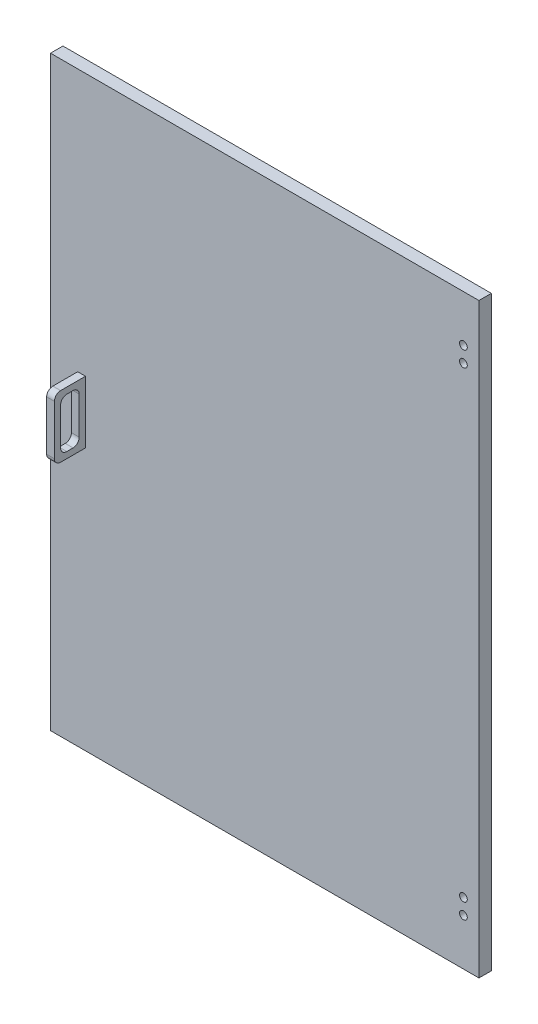
ISO-10303-21;
HEADER;
FILE_DESCRIPTION(('STEP AP214'),'2;1');
FILE_NAME('part.step','',(''),(''),'','','');
FILE_SCHEMA(('AUTOMOTIVE_DESIGN { 1 0 10303 214 1 1 1 1 }'));
ENDSEC;
DATA;
#1=APPLICATION_CONTEXT('core data for automotive mechanical design processes');
#2=APPLICATION_PROTOCOL_DEFINITION('international standard','automotive_design',2000,#1);
#3=PRODUCT_CONTEXT('',#1,'mechanical');
#4=PRODUCT('Part','Part','',(#3));
#5=PRODUCT_RELATED_PRODUCT_CATEGORY('part','',(#4));
#6=PRODUCT_DEFINITION_FORMATION('','',#4);
#7=PRODUCT_DEFINITION_CONTEXT('part definition',#1,'design');
#8=PRODUCT_DEFINITION('design','',#6,#7);
#9=PRODUCT_DEFINITION_SHAPE('','',#8);
#10=(LENGTH_UNIT() NAMED_UNIT(*) SI_UNIT(.MILLI.,.METRE.));
#11=(NAMED_UNIT(*) PLANE_ANGLE_UNIT() SI_UNIT($,.RADIAN.));
#12=(NAMED_UNIT(*) SI_UNIT($,.STERADIAN.) SOLID_ANGLE_UNIT());
#13=UNCERTAINTY_MEASURE_WITH_UNIT(LENGTH_MEASURE(1.E-05),#10,'distance_accuracy_value','');
#14=(GEOMETRIC_REPRESENTATION_CONTEXT(3) GLOBAL_UNCERTAINTY_ASSIGNED_CONTEXT((#13)) GLOBAL_UNIT_ASSIGNED_CONTEXT((#10,
#11,#12)) REPRESENTATION_CONTEXT('',''));
#15=CARTESIAN_POINT('',(0.,0.,0.));
#16=DIRECTION('',(0.,0.,1.));
#17=DIRECTION('',(1.,0.,0.));
#18=AXIS2_PLACEMENT_3D('',#15,#16,#17);
#19=CARTESIAN_POINT('',(0.,0.,0.));
#20=DIRECTION('',(0.,0.,1.));
#21=DIRECTION('',(1.,0.,0.));
#22=AXIS2_PLACEMENT_3D('',#19,#20,#21);
#23=PLANE('',#22);
#24=CARTESIAN_POINT('',(81.28,100.965,0.));
#25=DIRECTION('',(0.,0.,1.));
#26=DIRECTION('',(1.,0.,0.));
#27=AXIS2_PLACEMENT_3D('',#24,#25,#26);
#28=CIRCLE('',#27,1.58749999999999);
#29=CARTESIAN_POINT('',(82.8675,100.965,0.));
#30=VERTEX_POINT('',#29);
#31=EDGE_CURVE('E227',#30,#30,#28,.T.);
#32=ORIENTED_EDGE('',*,*,#31,.F.);
#33=EDGE_LOOP('',(#32));
#34=FACE_BOUND('',#33,.T.);
#35=CARTESIAN_POINT('',(81.28,94.615,0.));
#36=DIRECTION('',(0.,0.,1.));
#37=DIRECTION('',(1.,0.,0.));
#38=AXIS2_PLACEMENT_3D('',#35,#36,#37);
#39=CIRCLE('',#38,1.58749999999999);
#40=CARTESIAN_POINT('',(82.8675,94.615,0.));
#41=VERTEX_POINT('',#40);
#42=EDGE_CURVE('E231',#41,#41,#39,.T.);
#43=ORIENTED_EDGE('',*,*,#42,.F.);
#44=EDGE_LOOP('',(#43));
#45=FACE_BOUND('',#44,.T.);
#46=CARTESIAN_POINT('',(81.28,-94.615,0.));
#47=DIRECTION('',(0.,0.,1.));
#48=DIRECTION('',(-1.,0.,0.));
#49=AXIS2_PLACEMENT_3D('',#46,#47,#48);
#50=CIRCLE('',#49,1.58749999999999);
#51=CARTESIAN_POINT('',(79.6925,-94.615,0.));
#52=VERTEX_POINT('',#51);
#53=EDGE_CURVE('E239',#52,#52,#50,.T.);
#54=ORIENTED_EDGE('',*,*,#53,.F.);
#55=EDGE_LOOP('',(#54));
#56=FACE_BOUND('',#55,.T.);
#57=CARTESIAN_POINT('',(81.28,-100.965,0.));
#58=DIRECTION('',(0.,0.,1.));
#59=DIRECTION('',(-1.,0.,0.));
#60=AXIS2_PLACEMENT_3D('',#57,#58,#59);
#61=CIRCLE('',#60,1.58749999999999);
#62=CARTESIAN_POINT('',(79.6925,-100.965,0.));
#63=VERTEX_POINT('',#62);
#64=EDGE_CURVE('E247',#63,#63,#61,.T.);
#65=ORIENTED_EDGE('',*,*,#64,.F.);
#66=EDGE_LOOP('',(#65));
#67=FACE_BOUND('',#66,.T.);
#68=DIRECTION('',(0.,-1.,0.));
#69=VECTOR('',#68,1.);
#70=CARTESIAN_POINT('',(-87.63,120.015,0.));
#71=LINE('',#70,#69);
#72=CARTESIAN_POINT('',(-87.63,120.015,0.));
#73=VERTEX_POINT('',#72);
#74=CARTESIAN_POINT('',(-87.63,-120.015,0.));
#75=VERTEX_POINT('',#74);
#76=EDGE_CURVE('E226',#73,#75,#71,.T.);
#77=ORIENTED_EDGE('',*,*,#76,.T.);
#78=DIRECTION('',(1.,0.,0.));
#79=VECTOR('',#78,1.);
#80=CARTESIAN_POINT('',(-87.63,-120.015,0.));
#81=LINE('',#80,#79);
#82=CARTESIAN_POINT('',(87.63,-120.015,0.));
#83=VERTEX_POINT('',#82);
#84=EDGE_CURVE('E275',#75,#83,#81,.T.);
#85=ORIENTED_EDGE('',*,*,#84,.T.);
#86=DIRECTION('',(0.,1.,0.));
#87=VECTOR('',#86,1.);
#88=CARTESIAN_POINT('',(87.63,120.015,0.));
#89=LINE('',#88,#87);
#90=CARTESIAN_POINT('',(87.63,120.015,0.));
#91=VERTEX_POINT('',#90);
#92=EDGE_CURVE('E279',#83,#91,#89,.T.);
#93=ORIENTED_EDGE('',*,*,#92,.T.);
#94=DIRECTION('',(-1.,0.,0.));
#95=VECTOR('',#94,1.);
#96=CARTESIAN_POINT('',(-87.63,120.015,0.));
#97=LINE('',#96,#95);
#98=EDGE_CURVE('E259',#91,#73,#97,.T.);
#99=ORIENTED_EDGE('',*,*,#98,.T.);
#100=EDGE_LOOP('',(#77,#85,#93,#99));
#101=FACE_BOUND('',#100,.T.);
#102=DIRECTION('',(-1.,0.,0.));
#103=VECTOR('',#102,1.);
#104=CARTESIAN_POINT('',(-76.5175,12.7,0.));
#105=LINE('',#104,#103);
#106=CARTESIAN_POINT('',(-73.3425,12.7,0.));
#107=VERTEX_POINT('',#106);
#108=CARTESIAN_POINT('',(-76.5175,12.7,0.));
#109=VERTEX_POINT('',#108);
#110=EDGE_CURVE('E181',#107,#109,#105,.T.);
#111=ORIENTED_EDGE('',*,*,#110,.F.);
#112=DIRECTION('',(0.,1.,0.));
#113=VECTOR('',#112,1.);
#114=CARTESIAN_POINT('',(-73.3425,-12.7,0.));
#115=LINE('',#114,#113);
#116=CARTESIAN_POINT('',(-73.3425,-12.7,0.));
#117=VERTEX_POINT('',#116);
#118=EDGE_CURVE('E192',#117,#107,#115,.T.);
#119=ORIENTED_EDGE('',*,*,#118,.F.);
#120=DIRECTION('',(1.,0.,0.));
#121=VECTOR('',#120,1.);
#122=CARTESIAN_POINT('',(-76.5175,-12.7,0.));
#123=LINE('',#122,#121);
#124=CARTESIAN_POINT('',(-76.5175,-12.7,0.));
#125=VERTEX_POINT('',#124);
#126=EDGE_CURVE('E207',#125,#117,#123,.T.);
#127=ORIENTED_EDGE('',*,*,#126,.F.);
#128=DIRECTION('',(0.,-1.,0.));
#129=VECTOR('',#128,1.);
#130=CARTESIAN_POINT('',(-76.5175,-12.7,0.));
#131=LINE('',#130,#129);
#132=EDGE_CURVE('E203',#109,#125,#131,.T.);
#133=ORIENTED_EDGE('',*,*,#132,.F.);
#134=EDGE_LOOP('',(#111,#119,#127,#133));
#135=FACE_BOUND('',#134,.T.);
#136=ADVANCED_FACE('F51',(#34,#45,#56,#67,#101,#135),#23,.T.);
#137=CARTESIAN_POINT('',(-87.63,120.015,-5.08));
#138=DIRECTION('',(-1.,0.,0.));
#139=DIRECTION('',(0.,-1.,0.));
#140=AXIS2_PLACEMENT_3D('',#137,#138,#139);
#141=PLANE('',#140);
#142=ORIENTED_EDGE('',*,*,#76,.F.);
#143=DIRECTION('',(0.,0.,1.));
#144=VECTOR('',#143,1.);
#145=CARTESIAN_POINT('',(-87.63,120.015,-5.08));
#146=LINE('',#145,#144);
#147=CARTESIAN_POINT('',(-87.63,120.015,-5.08));
#148=VERTEX_POINT('',#147);
#149=EDGE_CURVE('E286',#148,#73,#146,.T.);
#150=ORIENTED_EDGE('',*,*,#149,.F.);
#151=DIRECTION('',(0.,-1.,0.));
#152=VECTOR('',#151,1.);
#153=CARTESIAN_POINT('',(-87.63,120.015,-5.08));
#154=LINE('',#153,#152);
#155=CARTESIAN_POINT('',(-87.63,-120.015,-5.08));
#156=VERTEX_POINT('',#155);
#157=EDGE_CURVE('E254',#148,#156,#154,.T.);
#158=ORIENTED_EDGE('',*,*,#157,.T.);
#159=DIRECTION('',(0.,0.,1.));
#160=VECTOR('',#159,1.);
#161=CARTESIAN_POINT('',(-87.63,-120.015,-5.08));
#162=LINE('',#161,#160);
#163=EDGE_CURVE('E271',#156,#75,#162,.T.);
#164=ORIENTED_EDGE('',*,*,#163,.T.);
#165=EDGE_LOOP('',(#142,#150,#158,#164));
#166=FACE_BOUND('',#165,.T.);
#167=ADVANCED_FACE('F454',(#166),#141,.T.);
#168=CARTESIAN_POINT('',(-87.63,120.015,-5.08));
#169=DIRECTION('',(0.,1.,0.));
#170=DIRECTION('',(0.,0.,1.));
#171=AXIS2_PLACEMENT_3D('',#168,#169,#170);
#172=PLANE('',#171);
#173=ORIENTED_EDGE('',*,*,#98,.F.);
#174=DIRECTION('',(0.,0.,1.));
#175=VECTOR('',#174,1.);
#176=CARTESIAN_POINT('',(87.63,120.015,-5.08));
#177=LINE('',#176,#175);
#178=CARTESIAN_POINT('',(87.63,120.015,-5.08));
#179=VERTEX_POINT('',#178);
#180=EDGE_CURVE('E290',#179,#91,#177,.T.);
#181=ORIENTED_EDGE('',*,*,#180,.F.);
#182=DIRECTION('',(-1.,0.,0.));
#183=VECTOR('',#182,1.);
#184=CARTESIAN_POINT('',(-87.63,120.015,-5.08));
#185=LINE('',#184,#183);
#186=EDGE_CURVE('E267',#179,#148,#185,.T.);
#187=ORIENTED_EDGE('',*,*,#186,.T.);
#188=ORIENTED_EDGE('',*,*,#149,.T.);
#189=EDGE_LOOP('',(#173,#181,#187,#188));
#190=FACE_BOUND('',#189,.T.);
#191=ADVANCED_FACE('F460',(#190),#172,.T.);
#192=CARTESIAN_POINT('',(87.63,120.015,-5.08));
#193=DIRECTION('',(1.,0.,0.));
#194=DIRECTION('',(0.,1.,0.));
#195=AXIS2_PLACEMENT_3D('',#192,#193,#194);
#196=PLANE('',#195);
#197=ORIENTED_EDGE('',*,*,#92,.F.);
#198=DIRECTION('',(0.,0.,1.));
#199=VECTOR('',#198,1.);
#200=CARTESIAN_POINT('',(87.63,-120.015,-5.08));
#201=LINE('',#200,#199);
#202=CARTESIAN_POINT('',(87.63,-120.015,-5.08));
#203=VERTEX_POINT('',#202);
#204=EDGE_CURVE('E293',#203,#83,#201,.T.);
#205=ORIENTED_EDGE('',*,*,#204,.F.);
#206=DIRECTION('',(0.,1.,0.));
#207=VECTOR('',#206,1.);
#208=CARTESIAN_POINT('',(87.63,120.015,-5.08));
#209=LINE('',#208,#207);
#210=EDGE_CURVE('E263',#203,#179,#209,.T.);
#211=ORIENTED_EDGE('',*,*,#210,.T.);
#212=ORIENTED_EDGE('',*,*,#180,.T.);
#213=EDGE_LOOP('',(#197,#205,#211,#212));
#214=FACE_BOUND('',#213,.T.);
#215=ADVANCED_FACE('F471',(#214),#196,.T.);
#216=CARTESIAN_POINT('',(-87.63,-120.015,-5.08));
#217=DIRECTION('',(0.,-1.,0.));
#218=DIRECTION('',(0.,0.,-1.));
#219=AXIS2_PLACEMENT_3D('',#216,#217,#218);
#220=PLANE('',#219);
#221=ORIENTED_EDGE('',*,*,#84,.F.);
#222=ORIENTED_EDGE('',*,*,#163,.F.);
#223=DIRECTION('',(1.,0.,0.));
#224=VECTOR('',#223,1.);
#225=CARTESIAN_POINT('',(-87.63,-120.015,-5.08));
#226=LINE('',#225,#224);
#227=EDGE_CURVE('E258',#156,#203,#226,.T.);
#228=ORIENTED_EDGE('',*,*,#227,.T.);
#229=ORIENTED_EDGE('',*,*,#204,.T.);
#230=EDGE_LOOP('',(#221,#222,#228,#229));
#231=FACE_BOUND('',#230,.T.);
#232=ADVANCED_FACE('F475',(#231),#220,.T.);
#233=CARTESIAN_POINT('',(0.,0.,-5.08));
#234=DIRECTION('',(0.,0.,1.));
#235=DIRECTION('',(1.,0.,0.));
#236=AXIS2_PLACEMENT_3D('',#233,#234,#235);
#237=PLANE('',#236);
#238=CARTESIAN_POINT('',(81.28,100.965,-5.08));
#239=DIRECTION('',(0.,0.,1.));
#240=DIRECTION('',(1.,0.,0.));
#241=AXIS2_PLACEMENT_3D('',#238,#239,#240);
#242=CIRCLE('',#241,1.58749999999999);
#243=CARTESIAN_POINT('',(82.8675,100.965,-5.08));
#244=VERTEX_POINT('',#243);
#245=EDGE_CURVE('E222',#244,#244,#242,.T.);
#246=ORIENTED_EDGE('',*,*,#245,.T.);
#247=EDGE_LOOP('',(#246));
#248=FACE_BOUND('',#247,.T.);
#249=CARTESIAN_POINT('',(81.28,94.615,-5.08));
#250=DIRECTION('',(0.,0.,1.));
#251=DIRECTION('',(1.,0.,0.));
#252=AXIS2_PLACEMENT_3D('',#249,#250,#251);
#253=CIRCLE('',#252,1.58749999999999);
#254=CARTESIAN_POINT('',(82.8675,94.615,-5.08));
#255=VERTEX_POINT('',#254);
#256=EDGE_CURVE('E235',#255,#255,#253,.T.);
#257=ORIENTED_EDGE('',*,*,#256,.T.);
#258=EDGE_LOOP('',(#257));
#259=FACE_BOUND('',#258,.T.);
#260=CARTESIAN_POINT('',(81.28,-94.615,-5.08));
#261=DIRECTION('',(0.,0.,1.));
#262=DIRECTION('',(-1.,0.,0.));
#263=AXIS2_PLACEMENT_3D('',#260,#261,#262);
#264=CIRCLE('',#263,1.58749999999999);
#265=CARTESIAN_POINT('',(79.6925,-94.615,-5.08));
#266=VERTEX_POINT('',#265);
#267=EDGE_CURVE('E243',#266,#266,#264,.T.);
#268=ORIENTED_EDGE('',*,*,#267,.T.);
#269=EDGE_LOOP('',(#268));
#270=FACE_BOUND('',#269,.T.);
#271=CARTESIAN_POINT('',(81.28,-100.965,-5.08));
#272=DIRECTION('',(0.,0.,1.));
#273=DIRECTION('',(-1.,0.,0.));
#274=AXIS2_PLACEMENT_3D('',#271,#272,#273);
#275=CIRCLE('',#274,1.58749999999999);
#276=CARTESIAN_POINT('',(79.6925,-100.965,-5.08));
#277=VERTEX_POINT('',#276);
#278=EDGE_CURVE('E188',#277,#277,#275,.T.);
#279=ORIENTED_EDGE('',*,*,#278,.T.);
#280=EDGE_LOOP('',(#279));
#281=FACE_BOUND('',#280,.T.);
#282=ORIENTED_EDGE('',*,*,#157,.F.);
#283=ORIENTED_EDGE('',*,*,#186,.F.);
#284=ORIENTED_EDGE('',*,*,#210,.F.);
#285=ORIENTED_EDGE('',*,*,#227,.F.);
#286=EDGE_LOOP('',(#282,#283,#284,#285));
#287=FACE_BOUND('',#286,.T.);
#288=ADVANCED_FACE('F467',(#248,#259,#270,#281,#287),#237,.F.);
#289=CARTESIAN_POINT('',(81.28,-100.965,-5.08));
#290=DIRECTION('',(0.,0.,1.));
#291=DIRECTION('',(1.,0.,0.));
#292=AXIS2_PLACEMENT_3D('',#289,#290,#291);
#293=CYLINDRICAL_SURFACE('',#292,1.58749999999999);
#294=ORIENTED_EDGE('',*,*,#278,.F.);
#295=EDGE_LOOP('',(#294));
#296=FACE_BOUND('',#295,.T.);
#297=ORIENTED_EDGE('',*,*,#64,.T.);
#298=EDGE_LOOP('',(#297));
#299=FACE_BOUND('',#298,.T.);
#300=ADVANCED_FACE('F615',(#296,#299),#293,.F.);
#301=CARTESIAN_POINT('',(81.28,-94.615,-5.08));
#302=DIRECTION('',(0.,0.,1.));
#303=DIRECTION('',(1.,0.,0.));
#304=AXIS2_PLACEMENT_3D('',#301,#302,#303);
#305=CYLINDRICAL_SURFACE('',#304,1.58749999999999);
#306=ORIENTED_EDGE('',*,*,#267,.F.);
#307=EDGE_LOOP('',(#306));
#308=FACE_BOUND('',#307,.T.);
#309=ORIENTED_EDGE('',*,*,#53,.T.);
#310=EDGE_LOOP('',(#309));
#311=FACE_BOUND('',#310,.T.);
#312=ADVANCED_FACE('F605',(#308,#311),#305,.F.);
#313=CARTESIAN_POINT('',(81.28,94.615,-5.08));
#314=DIRECTION('',(0.,0.,1.));
#315=DIRECTION('',(1.,0.,0.));
#316=AXIS2_PLACEMENT_3D('',#313,#314,#315);
#317=CYLINDRICAL_SURFACE('',#316,1.58749999999999);
#318=ORIENTED_EDGE('',*,*,#256,.F.);
#319=EDGE_LOOP('',(#318));
#320=FACE_BOUND('',#319,.T.);
#321=ORIENTED_EDGE('',*,*,#42,.T.);
#322=EDGE_LOOP('',(#321));
#323=FACE_BOUND('',#322,.T.);
#324=ADVANCED_FACE('F596',(#320,#323),#317,.F.);
#325=CARTESIAN_POINT('',(81.28,100.965,-5.08));
#326=DIRECTION('',(0.,0.,1.));
#327=DIRECTION('',(1.,0.,0.));
#328=AXIS2_PLACEMENT_3D('',#325,#326,#327);
#329=CYLINDRICAL_SURFACE('',#328,1.58749999999999);
#330=ORIENTED_EDGE('',*,*,#245,.F.);
#331=EDGE_LOOP('',(#330));
#332=FACE_BOUND('',#331,.T.);
#333=ORIENTED_EDGE('',*,*,#31,.T.);
#334=EDGE_LOOP('',(#333));
#335=FACE_BOUND('',#334,.T.);
#336=ADVANCED_FACE('F580',(#332,#335),#329,.F.);
#337=CARTESIAN_POINT('',(-73.3425,-12.7,12.7));
#338=DIRECTION('',(-1.,0.,0.));
#339=DIRECTION('',(0.,0.,1.));
#340=AXIS2_PLACEMENT_3D('',#337,#338,#339);
#341=PLANE('',#340);
#342=DIRECTION('',(0.,0.,1.));
#343=VECTOR('',#342,1.);
#344=CARTESIAN_POINT('',(-73.3425,10.16,10.16));
#345=LINE('',#344,#343);
#346=CARTESIAN_POINT('',(-73.3425,10.16,5.08));
#347=VERTEX_POINT('',#346);
#348=CARTESIAN_POINT('',(-73.3425,10.16,7.62));
#349=VERTEX_POINT('',#348);
#350=EDGE_CURVE('E417',#347,#349,#345,.T.);
#351=ORIENTED_EDGE('',*,*,#350,.F.);
#352=CARTESIAN_POINT('',(-73.3425,7.61999999999995,5.08));
#353=DIRECTION('',(-1.,0.,0.));
#354=DIRECTION('',(0.,0.,1.));
#355=AXIS2_PLACEMENT_3D('',#352,#353,#354);
#356=CIRCLE('',#355,2.54);
#357=CARTESIAN_POINT('',(-73.3425,7.61999999999995,2.54));
#358=VERTEX_POINT('',#357);
#359=EDGE_CURVE('E376',#347,#358,#356,.T.);
#360=ORIENTED_EDGE('',*,*,#359,.T.);
#361=DIRECTION('',(0.,1.,0.));
#362=VECTOR('',#361,1.);
#363=CARTESIAN_POINT('',(-73.3425,-10.16,2.54));
#364=LINE('',#363,#362);
#365=CARTESIAN_POINT('',(-73.3425,-7.61999999999995,2.54));
#366=VERTEX_POINT('',#365);
#367=EDGE_CURVE('E388',#366,#358,#364,.T.);
#368=ORIENTED_EDGE('',*,*,#367,.F.);
#369=CARTESIAN_POINT('',(-73.3425,-7.61999999999995,5.08));
#370=DIRECTION('',(-1.,0.,0.));
#371=DIRECTION('',(0.,0.,1.));
#372=AXIS2_PLACEMENT_3D('',#369,#370,#371);
#373=CIRCLE('',#372,2.54);
#374=CARTESIAN_POINT('',(-73.3425,-10.16,5.08));
#375=VERTEX_POINT('',#374);
#376=EDGE_CURVE('E60',#366,#375,#373,.T.);
#377=ORIENTED_EDGE('',*,*,#376,.T.);
#378=DIRECTION('',(0.,0.,-1.));
#379=VECTOR('',#378,1.);
#380=CARTESIAN_POINT('',(-73.3425,-10.16,10.16));
#381=LINE('',#380,#379);
#382=CARTESIAN_POINT('',(-73.3425,-10.16,7.62));
#383=VERTEX_POINT('',#382);
#384=EDGE_CURVE('E200',#383,#375,#381,.T.);
#385=ORIENTED_EDGE('',*,*,#384,.F.);
#386=CARTESIAN_POINT('',(-73.3425,-7.61999999999995,7.62));
#387=DIRECTION('',(-1.,0.,0.));
#388=DIRECTION('',(0.,0.,1.));
#389=AXIS2_PLACEMENT_3D('',#386,#387,#388);
#390=CIRCLE('',#389,2.54);
#391=CARTESIAN_POINT('',(-73.3425,-7.61999999999995,10.16));
#392=VERTEX_POINT('',#391);
#393=EDGE_CURVE('E370',#383,#392,#390,.T.);
#394=ORIENTED_EDGE('',*,*,#393,.T.);
#395=DIRECTION('',(0.,-1.,0.));
#396=VECTOR('',#395,1.);
#397=CARTESIAN_POINT('',(-73.3425,-10.16,10.16));
#398=LINE('',#397,#396);
#399=CARTESIAN_POINT('',(-73.3425,7.61999999999995,10.16));
#400=VERTEX_POINT('',#399);
#401=EDGE_CURVE('E397',#400,#392,#398,.T.);
#402=ORIENTED_EDGE('',*,*,#401,.F.);
#403=CARTESIAN_POINT('',(-73.3425,7.61999999999995,7.62));
#404=DIRECTION('',(-1.,0.,0.));
#405=DIRECTION('',(0.,0.,1.));
#406=AXIS2_PLACEMENT_3D('',#403,#404,#405);
#407=CIRCLE('',#406,2.54);
#408=EDGE_CURVE('E364',#400,#349,#407,.T.);
#409=ORIENTED_EDGE('',*,*,#408,.T.);
#410=EDGE_LOOP('',(#351,#360,#368,#377,#385,#394,#402,#409));
#411=FACE_BOUND('',#410,.T.);
#412=DIRECTION('',(0.,1.,0.));
#413=VECTOR('',#412,1.);
#414=CARTESIAN_POINT('',(-73.3425,-12.7,12.7));
#415=LINE('',#414,#413);
#416=CARTESIAN_POINT('',(-73.3425,-10.16,12.7));
#417=VERTEX_POINT('',#416);
#418=CARTESIAN_POINT('',(-73.3425,10.16,12.7));
#419=VERTEX_POINT('',#418);
#420=EDGE_CURVE('E213',#417,#419,#415,.T.);
#421=ORIENTED_EDGE('',*,*,#420,.F.);
#422=CARTESIAN_POINT('',(-73.3425,-10.16,10.16));
#423=DIRECTION('',(-1.,0.,0.));
#424=DIRECTION('',(0.,0.,1.));
#425=AXIS2_PLACEMENT_3D('',#422,#423,#424);
#426=CIRCLE('',#425,2.54);
#427=CARTESIAN_POINT('',(-73.3425,-12.7,10.16));
#428=VERTEX_POINT('',#427);
#429=EDGE_CURVE('E352',#417,#428,#426,.F.);
#430=ORIENTED_EDGE('',*,*,#429,.T.);
#431=DIRECTION('',(0.,0.,-1.));
#432=VECTOR('',#431,1.);
#433=CARTESIAN_POINT('',(-73.3425,-12.7,12.7));
#434=LINE('',#433,#432);
#435=EDGE_CURVE('E195',#428,#117,#434,.T.);
#436=ORIENTED_EDGE('',*,*,#435,.T.);
#437=ORIENTED_EDGE('',*,*,#118,.T.);
#438=DIRECTION('',(0.,0.,-1.));
#439=VECTOR('',#438,1.);
#440=CARTESIAN_POINT('',(-73.3425,12.7,12.7));
#441=LINE('',#440,#439);
#442=CARTESIAN_POINT('',(-73.3425,12.7,10.16));
#443=VERTEX_POINT('',#442);
#444=EDGE_CURVE('E177',#443,#107,#441,.T.);
#445=ORIENTED_EDGE('',*,*,#444,.F.);
#446=CARTESIAN_POINT('',(-73.3425,10.16,10.16));
#447=DIRECTION('',(-1.,0.,0.));
#448=DIRECTION('',(0.,0.,1.));
#449=AXIS2_PLACEMENT_3D('',#446,#447,#448);
#450=CIRCLE('',#449,2.54);
#451=EDGE_CURVE('E349',#443,#419,#450,.F.);
#452=ORIENTED_EDGE('',*,*,#451,.T.);
#453=EDGE_LOOP('',(#421,#430,#436,#437,#445,#452));
#454=FACE_BOUND('',#453,.T.);
#455=ADVANCED_FACE('F194',(#411,#454),#341,.F.);
#456=CARTESIAN_POINT('',(-76.5175,12.7,12.7));
#457=DIRECTION('',(0.,-1.,0.));
#458=DIRECTION('',(0.,0.,-1.));
#459=AXIS2_PLACEMENT_3D('',#456,#457,#458);
#460=PLANE('',#459);
#461=DIRECTION('',(0.,0.,-1.));
#462=VECTOR('',#461,1.);
#463=CARTESIAN_POINT('',(-76.5175,12.7,12.7));
#464=LINE('',#463,#462);
#465=CARTESIAN_POINT('',(-76.5175,12.7,10.16));
#466=VERTEX_POINT('',#465);
#467=EDGE_CURVE('E189',#466,#109,#464,.T.);
#468=ORIENTED_EDGE('',*,*,#467,.F.);
#469=DIRECTION('',(-1.,0.,0.));
#470=VECTOR('',#469,1.);
#471=CARTESIAN_POINT('',(-76.5175,12.7,10.16));
#472=LINE('',#471,#470);
#473=EDGE_CURVE('E184',#466,#443,#472,.F.);
#474=ORIENTED_EDGE('',*,*,#473,.T.);
#475=ORIENTED_EDGE('',*,*,#444,.T.);
#476=ORIENTED_EDGE('',*,*,#110,.T.);
#477=EDGE_LOOP('',(#468,#474,#475,#476));
#478=FACE_BOUND('',#477,.T.);
#479=ADVANCED_FACE('F179',(#478),#460,.F.);
#480=CARTESIAN_POINT('',(-76.5175,-12.7,12.7));
#481=DIRECTION('',(1.,0.,0.));
#482=DIRECTION('',(0.,0.,-1.));
#483=AXIS2_PLACEMENT_3D('',#480,#481,#482);
#484=PLANE('',#483);
#485=DIRECTION('',(0.,-1.,0.));
#486=VECTOR('',#485,1.);
#487=CARTESIAN_POINT('',(-76.5175,-12.7,10.16));
#488=LINE('',#487,#486);
#489=CARTESIAN_POINT('',(-76.5175,7.61999999999995,10.16));
#490=VERTEX_POINT('',#489);
#491=CARTESIAN_POINT('',(-76.5175,-7.61999999999995,10.16));
#492=VERTEX_POINT('',#491);
#493=EDGE_CURVE('E301',#490,#492,#488,.T.);
#494=ORIENTED_EDGE('',*,*,#493,.T.);
#495=CARTESIAN_POINT('',(-76.5175,-7.61999999999995,7.62));
#496=DIRECTION('',(1.,0.,0.));
#497=DIRECTION('',(0.,0.,-1.));
#498=AXIS2_PLACEMENT_3D('',#495,#496,#497);
#499=CIRCLE('',#498,2.54);
#500=CARTESIAN_POINT('',(-76.5175,-10.16,7.62));
#501=VERTEX_POINT('',#500);
#502=EDGE_CURVE('E373',#492,#501,#499,.T.);
#503=ORIENTED_EDGE('',*,*,#502,.T.);
#504=DIRECTION('',(0.,0.,-1.));
#505=VECTOR('',#504,1.);
#506=CARTESIAN_POINT('',(-76.5175,-10.16,12.7));
#507=LINE('',#506,#505);
#508=CARTESIAN_POINT('',(-76.5175,-10.16,5.08));
#509=VERTEX_POINT('',#508);
#510=EDGE_CURVE('E305',#501,#509,#507,.T.);
#511=ORIENTED_EDGE('',*,*,#510,.T.);
#512=CARTESIAN_POINT('',(-76.5175,-7.61999999999995,5.08));
#513=DIRECTION('',(1.,0.,0.));
#514=DIRECTION('',(0.,0.,-1.));
#515=AXIS2_PLACEMENT_3D('',#512,#513,#514);
#516=CIRCLE('',#515,2.54);
#517=CARTESIAN_POINT('',(-76.5175,-7.61999999999995,2.54));
#518=VERTEX_POINT('',#517);
#519=EDGE_CURVE('E11',#509,#518,#516,.T.);
#520=ORIENTED_EDGE('',*,*,#519,.T.);
#521=DIRECTION('',(0.,1.,0.));
#522=VECTOR('',#521,1.);
#523=CARTESIAN_POINT('',(-76.5175,-12.7,2.54));
#524=LINE('',#523,#522);
#525=CARTESIAN_POINT('',(-76.5175,7.61999999999995,2.54));
#526=VERTEX_POINT('',#525);
#527=EDGE_CURVE('E309',#518,#526,#524,.T.);
#528=ORIENTED_EDGE('',*,*,#527,.T.);
#529=CARTESIAN_POINT('',(-76.5175,7.61999999999995,5.08));
#530=DIRECTION('',(1.,0.,0.));
#531=DIRECTION('',(0.,0.,-1.));
#532=AXIS2_PLACEMENT_3D('',#529,#530,#531);
#533=CIRCLE('',#532,2.54);
#534=CARTESIAN_POINT('',(-76.5175,10.16,5.08));
#535=VERTEX_POINT('',#534);
#536=EDGE_CURVE('E379',#526,#535,#533,.T.);
#537=ORIENTED_EDGE('',*,*,#536,.T.);
#538=DIRECTION('',(0.,0.,1.));
#539=VECTOR('',#538,1.);
#540=CARTESIAN_POINT('',(-76.5175,10.16,12.7));
#541=LINE('',#540,#539);
#542=CARTESIAN_POINT('',(-76.5175,10.16,7.62));
#543=VERTEX_POINT('',#542);
#544=EDGE_CURVE('E289',#535,#543,#541,.T.);
#545=ORIENTED_EDGE('',*,*,#544,.T.);
#546=CARTESIAN_POINT('',(-76.5175,7.61999999999995,7.62));
#547=DIRECTION('',(1.,0.,0.));
#548=DIRECTION('',(0.,0.,-1.));
#549=AXIS2_PLACEMENT_3D('',#546,#547,#548);
#550=CIRCLE('',#549,2.54);
#551=EDGE_CURVE('E367',#543,#490,#550,.T.);
#552=ORIENTED_EDGE('',*,*,#551,.T.);
#553=EDGE_LOOP('',(#494,#503,#511,#520,#528,#537,#545,#552));
#554=FACE_BOUND('',#553,.T.);
#555=DIRECTION('',(0.,0.,-1.));
#556=VECTOR('',#555,1.);
#557=CARTESIAN_POINT('',(-76.5175,-12.7,12.7));
#558=LINE('',#557,#556);
#559=CARTESIAN_POINT('',(-76.5175,-12.7,10.16));
#560=VERTEX_POINT('',#559);
#561=EDGE_CURVE('E216',#560,#125,#558,.T.);
#562=ORIENTED_EDGE('',*,*,#561,.F.);
#563=CARTESIAN_POINT('',(-76.5175,-10.16,10.16));
#564=DIRECTION('',(1.,0.,0.));
#565=DIRECTION('',(0.,0.,-1.));
#566=AXIS2_PLACEMENT_3D('',#563,#564,#565);
#567=CIRCLE('',#566,2.54);
#568=CARTESIAN_POINT('',(-76.5175,-10.16,12.7));
#569=VERTEX_POINT('',#568);
#570=EDGE_CURVE('E359',#560,#569,#567,.F.);
#571=ORIENTED_EDGE('',*,*,#570,.T.);
#572=DIRECTION('',(0.,-1.,0.));
#573=VECTOR('',#572,1.);
#574=CARTESIAN_POINT('',(-76.5175,-12.7,12.7));
#575=LINE('',#574,#573);
#576=CARTESIAN_POINT('',(-76.5175,10.16,12.7));
#577=VERTEX_POINT('',#576);
#578=EDGE_CURVE('E217',#577,#569,#575,.T.);
#579=ORIENTED_EDGE('',*,*,#578,.F.);
#580=CARTESIAN_POINT('',(-76.5175,10.16,10.16));
#581=DIRECTION('',(1.,0.,0.));
#582=DIRECTION('',(0.,0.,-1.));
#583=AXIS2_PLACEMENT_3D('',#580,#581,#582);
#584=CIRCLE('',#583,2.54);
#585=EDGE_CURVE('E67',#577,#466,#584,.F.);
#586=ORIENTED_EDGE('',*,*,#585,.T.);
#587=ORIENTED_EDGE('',*,*,#467,.T.);
#588=ORIENTED_EDGE('',*,*,#132,.T.);
#589=EDGE_LOOP('',(#562,#571,#579,#586,#587,#588));
#590=FACE_BOUND('',#589,.T.);
#591=ADVANCED_FACE('F403',(#554,#590),#484,.F.);
#592=CARTESIAN_POINT('',(-76.5175,-12.7,12.7));
#593=DIRECTION('',(0.,1.,0.));
#594=DIRECTION('',(0.,0.,1.));
#595=AXIS2_PLACEMENT_3D('',#592,#593,#594);
#596=PLANE('',#595);
#597=ORIENTED_EDGE('',*,*,#435,.F.);
#598=DIRECTION('',(1.,0.,0.));
#599=VECTOR('',#598,1.);
#600=CARTESIAN_POINT('',(-76.5175,-12.7,10.16));
#601=LINE('',#600,#599);
#602=EDGE_CURVE('E75',#428,#560,#601,.F.);
#603=ORIENTED_EDGE('',*,*,#602,.T.);
#604=ORIENTED_EDGE('',*,*,#561,.T.);
#605=ORIENTED_EDGE('',*,*,#126,.T.);
#606=EDGE_LOOP('',(#597,#603,#604,#605));
#607=FACE_BOUND('',#606,.T.);
#608=ADVANCED_FACE('F447',(#607),#596,.F.);
#609=CARTESIAN_POINT('',(0.,0.,12.7));
#610=DIRECTION('',(0.,0.,-1.));
#611=DIRECTION('',(-1.,0.,0.));
#612=AXIS2_PLACEMENT_3D('',#609,#610,#611);
#613=PLANE('',#612);
#614=ORIENTED_EDGE('',*,*,#578,.T.);
#615=DIRECTION('',(1.,0.,0.));
#616=VECTOR('',#615,1.);
#617=CARTESIAN_POINT('',(0.,-10.16,12.7));
#618=LINE('',#617,#616);
#619=EDGE_CURVE('E345',#569,#417,#618,.T.);
#620=ORIENTED_EDGE('',*,*,#619,.T.);
#621=ORIENTED_EDGE('',*,*,#420,.T.);
#622=DIRECTION('',(-1.,0.,0.));
#623=VECTOR('',#622,1.);
#624=CARTESIAN_POINT('',(0.,10.16,12.7));
#625=LINE('',#624,#623);
#626=EDGE_CURVE('E341',#419,#577,#625,.T.);
#627=ORIENTED_EDGE('',*,*,#626,.T.);
#628=EDGE_LOOP('',(#614,#620,#621,#627));
#629=FACE_BOUND('',#628,.T.);
#630=ADVANCED_FACE('F442',(#629),#613,.F.);
#631=CARTESIAN_POINT('',(-87.63,-10.16,2.54));
#632=DIRECTION('',(0.,0.,-1.));
#633=DIRECTION('',(-1.,0.,0.));
#634=AXIS2_PLACEMENT_3D('',#631,#632,#633);
#635=PLANE('',#634);
#636=ORIENTED_EDGE('',*,*,#367,.T.);
#637=DIRECTION('',(1.,0.,0.));
#638=VECTOR('',#637,1.);
#639=CARTESIAN_POINT('',(-76.5175,7.61999999999995,2.54));
#640=LINE('',#639,#638);
#641=EDGE_CURVE('E338',#358,#526,#640,.F.);
#642=ORIENTED_EDGE('',*,*,#641,.T.);
#643=ORIENTED_EDGE('',*,*,#527,.F.);
#644=DIRECTION('',(1.,0.,0.));
#645=VECTOR('',#644,1.);
#646=CARTESIAN_POINT('',(-73.3425,-7.61999999999995,2.54));
#647=LINE('',#646,#645);
#648=EDGE_CURVE('E334',#518,#366,#647,.T.);
#649=ORIENTED_EDGE('',*,*,#648,.T.);
#650=EDGE_LOOP('',(#636,#642,#643,#649));
#651=FACE_BOUND('',#650,.T.);
#652=ADVANCED_FACE('F406',(#651),#635,.F.);
#653=CARTESIAN_POINT('',(-87.63,-10.16,10.16));
#654=DIRECTION('',(0.,-1.,0.));
#655=DIRECTION('',(0.,0.,-1.));
#656=AXIS2_PLACEMENT_3D('',#653,#654,#655);
#657=PLANE('',#656);
#658=ORIENTED_EDGE('',*,*,#510,.F.);
#659=DIRECTION('',(1.,0.,0.));
#660=VECTOR('',#659,1.);
#661=CARTESIAN_POINT('',(-73.3425,-10.16,7.62));
#662=LINE('',#661,#660);
#663=EDGE_CURVE('E330',#501,#383,#662,.T.);
#664=ORIENTED_EDGE('',*,*,#663,.T.);
#665=ORIENTED_EDGE('',*,*,#384,.T.);
#666=DIRECTION('',(1.,0.,0.));
#667=VECTOR('',#666,1.);
#668=CARTESIAN_POINT('',(-76.5175,-10.16,5.08));
#669=LINE('',#668,#667);
#670=EDGE_CURVE('E327',#375,#509,#669,.F.);
#671=ORIENTED_EDGE('',*,*,#670,.T.);
#672=EDGE_LOOP('',(#658,#664,#665,#671));
#673=FACE_BOUND('',#672,.T.);
#674=ADVANCED_FACE('F394',(#673),#657,.F.);
#675=CARTESIAN_POINT('',(-87.63,-10.16,10.16));
#676=DIRECTION('',(0.,0.,1.));
#677=DIRECTION('',(1.,0.,0.));
#678=AXIS2_PLACEMENT_3D('',#675,#676,#677);
#679=PLANE('',#678);
#680=ORIENTED_EDGE('',*,*,#493,.F.);
#681=DIRECTION('',(1.,0.,0.));
#682=VECTOR('',#681,1.);
#683=CARTESIAN_POINT('',(-73.3425,7.61999999999995,10.16));
#684=LINE('',#683,#682);
#685=EDGE_CURVE('E316',#490,#400,#684,.T.);
#686=ORIENTED_EDGE('',*,*,#685,.T.);
#687=ORIENTED_EDGE('',*,*,#401,.T.);
#688=DIRECTION('',(1.,0.,0.));
#689=VECTOR('',#688,1.);
#690=CARTESIAN_POINT('',(-76.5175,-7.61999999999995,10.16));
#691=LINE('',#690,#689);
#692=EDGE_CURVE('E313',#392,#492,#691,.F.);
#693=ORIENTED_EDGE('',*,*,#692,.T.);
#694=EDGE_LOOP('',(#680,#686,#687,#693));
#695=FACE_BOUND('',#694,.T.);
#696=ADVANCED_FACE('F424',(#695),#679,.F.);
#697=CARTESIAN_POINT('',(-87.63,10.16,10.16));
#698=DIRECTION('',(0.,1.,0.));
#699=DIRECTION('',(0.,0.,1.));
#700=AXIS2_PLACEMENT_3D('',#697,#698,#699);
#701=PLANE('',#700);
#702=ORIENTED_EDGE('',*,*,#350,.T.);
#703=DIRECTION('',(1.,0.,0.));
#704=VECTOR('',#703,1.);
#705=CARTESIAN_POINT('',(-76.5175,10.16,7.62));
#706=LINE('',#705,#704);
#707=EDGE_CURVE('E324',#349,#543,#706,.F.);
#708=ORIENTED_EDGE('',*,*,#707,.T.);
#709=ORIENTED_EDGE('',*,*,#544,.F.);
#710=DIRECTION('',(1.,0.,0.));
#711=VECTOR('',#710,1.);
#712=CARTESIAN_POINT('',(-73.3425,10.16,5.08));
#713=LINE('',#712,#711);
#714=EDGE_CURVE('E320',#535,#347,#713,.T.);
#715=ORIENTED_EDGE('',*,*,#714,.T.);
#716=EDGE_LOOP('',(#702,#708,#709,#715));
#717=FACE_BOUND('',#716,.T.);
#718=ADVANCED_FACE('F415',(#717),#701,.F.);
#719=CARTESIAN_POINT('',(-87.63,7.61999999999995,7.62));
#720=DIRECTION('',(-1.,0.,0.));
#721=DIRECTION('',(0.,0.,1.));
#722=AXIS2_PLACEMENT_3D('',#719,#720,#721);
#723=CYLINDRICAL_SURFACE('',#722,2.54);
#724=ORIENTED_EDGE('',*,*,#551,.F.);
#725=ORIENTED_EDGE('',*,*,#707,.F.);
#726=ORIENTED_EDGE('',*,*,#408,.F.);
#727=ORIENTED_EDGE('',*,*,#685,.F.);
#728=EDGE_LOOP('',(#724,#725,#726,#727));
#729=FACE_BOUND('',#728,.T.);
#730=ADVANCED_FACE('F419',(#729),#723,.F.);
#731=CARTESIAN_POINT('',(-87.63,-7.61999999999995,7.62));
#732=DIRECTION('',(-1.,0.,0.));
#733=DIRECTION('',(0.,0.,1.));
#734=AXIS2_PLACEMENT_3D('',#731,#732,#733);
#735=CYLINDRICAL_SURFACE('',#734,2.54);
#736=ORIENTED_EDGE('',*,*,#502,.F.);
#737=ORIENTED_EDGE('',*,*,#692,.F.);
#738=ORIENTED_EDGE('',*,*,#393,.F.);
#739=ORIENTED_EDGE('',*,*,#663,.F.);
#740=EDGE_LOOP('',(#736,#737,#738,#739));
#741=FACE_BOUND('',#740,.T.);
#742=ADVANCED_FACE('F429',(#741),#735,.F.);
#743=CARTESIAN_POINT('',(-87.63,7.61999999999995,5.08));
#744=DIRECTION('',(-1.,0.,0.));
#745=DIRECTION('',(0.,0.,1.));
#746=AXIS2_PLACEMENT_3D('',#743,#744,#745);
#747=CYLINDRICAL_SURFACE('',#746,2.54);
#748=ORIENTED_EDGE('',*,*,#536,.F.);
#749=ORIENTED_EDGE('',*,*,#641,.F.);
#750=ORIENTED_EDGE('',*,*,#359,.F.);
#751=ORIENTED_EDGE('',*,*,#714,.F.);
#752=EDGE_LOOP('',(#748,#749,#750,#751));
#753=FACE_BOUND('',#752,.T.);
#754=ADVANCED_FACE('F409',(#753),#747,.F.);
#755=CARTESIAN_POINT('',(-87.63,-7.61999999999995,5.08));
#756=DIRECTION('',(-1.,0.,0.));
#757=DIRECTION('',(0.,0.,1.));
#758=AXIS2_PLACEMENT_3D('',#755,#756,#757);
#759=CYLINDRICAL_SURFACE('',#758,2.54);
#760=ORIENTED_EDGE('',*,*,#519,.F.);
#761=ORIENTED_EDGE('',*,*,#670,.F.);
#762=ORIENTED_EDGE('',*,*,#376,.F.);
#763=ORIENTED_EDGE('',*,*,#648,.F.);
#764=EDGE_LOOP('',(#760,#761,#762,#763));
#765=FACE_BOUND('',#764,.T.);
#766=ADVANCED_FACE('F400',(#765),#759,.F.);
#767=CARTESIAN_POINT('',(0.,-10.16,10.16));
#768=DIRECTION('',(1.,0.,0.));
#769=DIRECTION('',(0.,0.,-1.));
#770=AXIS2_PLACEMENT_3D('',#767,#768,#769);
#771=CYLINDRICAL_SURFACE('',#770,2.54);
#772=ORIENTED_EDGE('',*,*,#570,.F.);
#773=ORIENTED_EDGE('',*,*,#602,.F.);
#774=ORIENTED_EDGE('',*,*,#429,.F.);
#775=ORIENTED_EDGE('',*,*,#619,.F.);
#776=EDGE_LOOP('',(#772,#773,#774,#775));
#777=FACE_BOUND('',#776,.T.);
#778=ADVANCED_FACE('F446',(#777),#771,.T.);
#779=CARTESIAN_POINT('',(0.,10.16,10.16));
#780=DIRECTION('',(-1.,0.,0.));
#781=DIRECTION('',(0.,0.,1.));
#782=AXIS2_PLACEMENT_3D('',#779,#780,#781);
#783=CYLINDRICAL_SURFACE('',#782,2.54);
#784=ORIENTED_EDGE('',*,*,#451,.F.);
#785=ORIENTED_EDGE('',*,*,#473,.F.);
#786=ORIENTED_EDGE('',*,*,#585,.F.);
#787=ORIENTED_EDGE('',*,*,#626,.F.);
#788=EDGE_LOOP('',(#784,#785,#786,#787));
#789=FACE_BOUND('',#788,.T.);
#790=ADVANCED_FACE('F53',(#789),#783,.T.);
#791=CLOSED_SHELL('',(#136,#167,#191,#215,#232,#288,#300,#312,#324,#336,#455,#479,#591,#608,
#630,#652,#674,#696,#718,#730,#742,#754,#766,#778,#790));
#792=MANIFOLD_SOLID_BREP('B2',#791);
#793=ADVANCED_BREP_SHAPE_REPRESENTATION('',(#18,#792),#14);
#794=SHAPE_DEFINITION_REPRESENTATION(#9,#793);
ENDSEC;
END-ISO-10303-21;
